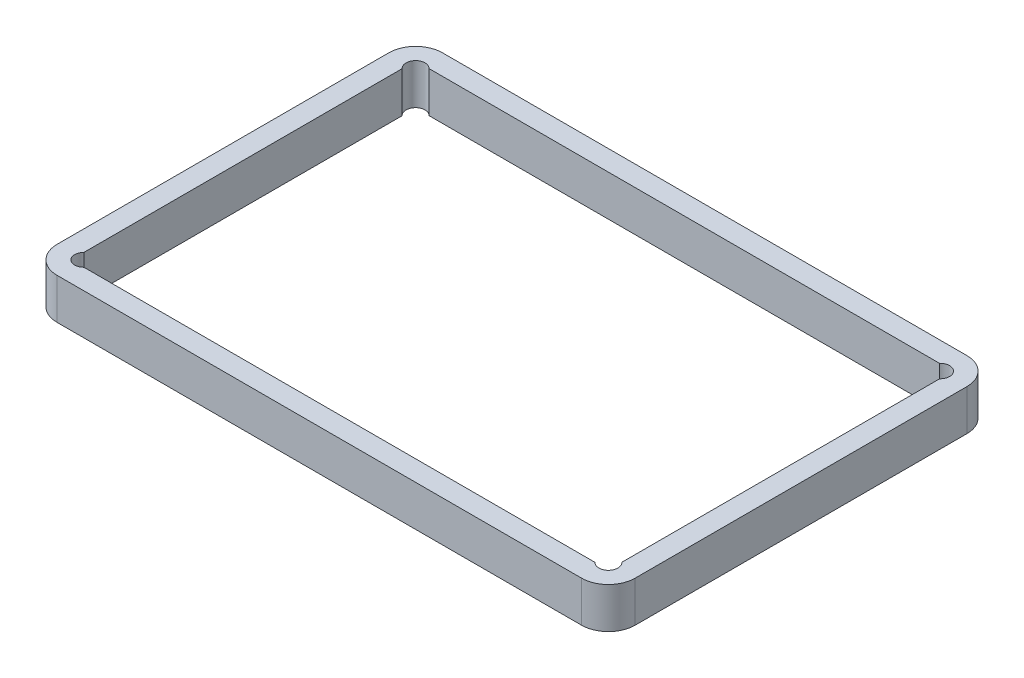
ISO-10303-21;
HEADER;
FILE_DESCRIPTION(('STEP AP214'),'2;1');
FILE_NAME('part.step','',(''),(''),'','','');
FILE_SCHEMA(('AUTOMOTIVE_DESIGN { 1 0 10303 214 1 1 1 1 }'));
ENDSEC;
DATA;
#1=APPLICATION_CONTEXT('core data for automotive mechanical design processes');
#2=APPLICATION_PROTOCOL_DEFINITION('international standard','automotive_design',2000,#1);
#3=PRODUCT_CONTEXT('',#1,'mechanical');
#4=PRODUCT('Part','Part','',(#3));
#5=PRODUCT_RELATED_PRODUCT_CATEGORY('part','',(#4));
#6=PRODUCT_DEFINITION_FORMATION('','',#4);
#7=PRODUCT_DEFINITION_CONTEXT('part definition',#1,'design');
#8=PRODUCT_DEFINITION('design','',#6,#7);
#9=PRODUCT_DEFINITION_SHAPE('','',#8);
#10=(LENGTH_UNIT() NAMED_UNIT(*) SI_UNIT(.MILLI.,.METRE.));
#11=(NAMED_UNIT(*) PLANE_ANGLE_UNIT() SI_UNIT($,.RADIAN.));
#12=(NAMED_UNIT(*) SI_UNIT($,.STERADIAN.) SOLID_ANGLE_UNIT());
#13=UNCERTAINTY_MEASURE_WITH_UNIT(LENGTH_MEASURE(1.E-05),#10,'distance_accuracy_value','');
#14=(GEOMETRIC_REPRESENTATION_CONTEXT(3) GLOBAL_UNCERTAINTY_ASSIGNED_CONTEXT((#13)) GLOBAL_UNIT_ASSIGNED_CONTEXT((#10,
#11,#12)) REPRESENTATION_CONTEXT('',''));
#15=CARTESIAN_POINT('',(0.,0.,0.));
#16=DIRECTION('',(0.,0.,1.));
#17=DIRECTION('',(1.,0.,0.));
#18=AXIS2_PLACEMENT_3D('',#15,#16,#17);
#19=CARTESIAN_POINT('',(-40.825,6.35,-25.825));
#20=DIRECTION('',(0.,1.,0.));
#21=DIRECTION('',(0.,0.,1.));
#22=AXIS2_PLACEMENT_3D('',#19,#20,#21);
#23=PLANE('',#22);
#24=CARTESIAN_POINT('',(-40.8250000000023,6.35,-25.8135633602445));
#25=DIRECTION('',(0.,-1.,0.));
#26=DIRECTION('',(0.,0.,-1.));
#27=AXIS2_PLACEMENT_3D('',#24,#25,#26);
#28=CIRCLE('',#27,1.47320000000609);
#29=CARTESIAN_POINT('',(-41.825,6.35,-24.7317508811047));
#30=VERTEX_POINT('',#29);
#31=CARTESIAN_POINT('',(-39.7538724801533,6.35,-26.825));
#32=VERTEX_POINT('',#31);
#33=EDGE_CURVE('E46',#30,#32,#28,.T.);
#34=ORIENTED_EDGE('',*,*,#33,.T.);
#35=DIRECTION('',(-1.,0.,0.));
#36=VECTOR('',#35,1.);
#37=CARTESIAN_POINT('',(-40.825,6.35,-26.825));
#38=LINE('',#37,#36);
#39=CARTESIAN_POINT('',(39.7431875208462,6.35,-26.825));
#40=VERTEX_POINT('',#39);
#41=EDGE_CURVE('E156',#40,#32,#38,.T.);
#42=ORIENTED_EDGE('',*,*,#41,.F.);
#43=CARTESIAN_POINT('',(40.8249999999977,6.35,-25.8250000000149));
#44=DIRECTION('',(0.,-1.,0.));
#45=DIRECTION('',(0.,0.,-1.));
#46=AXIS2_PLACEMENT_3D('',#43,#44,#45);
#47=CIRCLE('',#46,1.47320000000611);
#48=CARTESIAN_POINT('',(41.825,6.35,-24.7431875208794));
#49=VERTEX_POINT('',#48);
#50=EDGE_CURVE('E54',#40,#49,#47,.T.);
#51=ORIENTED_EDGE('',*,*,#50,.T.);
#52=DIRECTION('',(0.,0.,-1.));
#53=VECTOR('',#52,1.);
#54=CARTESIAN_POINT('',(41.825,6.35,-25.825));
#55=LINE('',#54,#53);
#56=CARTESIAN_POINT('',(41.825,6.35,24.7330671509533));
#57=VERTEX_POINT('',#56);
#58=EDGE_CURVE('E241',#57,#49,#55,.T.);
#59=ORIENTED_EDGE('',*,*,#58,.F.);
#60=CARTESIAN_POINT('',(40.8249999999984,6.35,25.8148796300894));
#61=DIRECTION('',(0.,-1.,0.));
#62=DIRECTION('',(0.,0.,-1.));
#63=AXIS2_PLACEMENT_3D('',#60,#61,#62);
#64=CIRCLE('',#63,1.47320000000605);
#65=CARTESIAN_POINT('',(39.7526310903831,6.35,26.825));
#66=VERTEX_POINT('',#65);
#67=EDGE_CURVE('E267',#57,#66,#64,.T.);
#68=ORIENTED_EDGE('',*,*,#67,.T.);
#69=DIRECTION('',(1.,0.,0.));
#70=VECTOR('',#69,1.);
#71=CARTESIAN_POINT('',(40.825,6.35,26.825));
#72=LINE('',#71,#70);
#73=CARTESIAN_POINT('',(-39.8134557548053,6.35,26.825));
#74=VERTEX_POINT('',#73);
#75=EDGE_CURVE('E165',#74,#66,#72,.T.);
#76=ORIENTED_EDGE('',*,*,#75,.F.);
#77=CARTESIAN_POINT('',(-40.8250000000016,6.35,25.8249999999863));
#78=DIRECTION('',(0.,-1.,0.));
#79=DIRECTION('',(0.,0.,-1.));
#80=AXIS2_PLACEMENT_3D('',#77,#78,#79);
#81=CIRCLE('',#80,1.42240000000603);
#82=CARTESIAN_POINT('',(-41.825,6.35,24.8134557547748));
#83=VERTEX_POINT('',#82);
#84=EDGE_CURVE('E251',#74,#83,#81,.T.);
#85=ORIENTED_EDGE('',*,*,#84,.T.);
#86=DIRECTION('',(0.,0.,1.));
#87=VECTOR('',#86,1.);
#88=CARTESIAN_POINT('',(-41.825,6.35,25.825));
#89=LINE('',#88,#87);
#90=EDGE_CURVE('E194',#30,#83,#89,.T.);
#91=ORIENTED_EDGE('',*,*,#90,.F.);
#92=EDGE_LOOP('',(#34,#42,#51,#59,#68,#76,#85,#91));
#93=FACE_BOUND('',#92,.T.);
#94=CARTESIAN_POINT('',(-40.825,6.35,-25.825));
#95=DIRECTION('',(0.,1.,0.));
#96=DIRECTION('',(0.,0.,1.));
#97=AXIS2_PLACEMENT_3D('',#94,#95,#96);
#98=CIRCLE('',#97,4.17499999999999);
#99=CARTESIAN_POINT('',(-40.825,6.35,-30.));
#100=VERTEX_POINT('',#99);
#101=CARTESIAN_POINT('',(-45.,6.35,-25.825));
#102=VERTEX_POINT('',#101);
#103=EDGE_CURVE('E171',#100,#102,#98,.T.);
#104=ORIENTED_EDGE('',*,*,#103,.T.);
#105=DIRECTION('',(0.,0.,1.));
#106=VECTOR('',#105,1.);
#107=CARTESIAN_POINT('',(-45.,6.35,-25.825));
#108=LINE('',#107,#106);
#109=CARTESIAN_POINT('',(-45.,6.35,25.825));
#110=VERTEX_POINT('',#109);
#111=EDGE_CURVE('E174',#102,#110,#108,.T.);
#112=ORIENTED_EDGE('',*,*,#111,.T.);
#113=CARTESIAN_POINT('',(-40.825,6.35,25.825));
#114=DIRECTION('',(0.,1.,0.));
#115=DIRECTION('',(0.,0.,1.));
#116=AXIS2_PLACEMENT_3D('',#113,#114,#115);
#117=CIRCLE('',#116,4.17500000000001);
#118=CARTESIAN_POINT('',(-40.825,6.35,30.));
#119=VERTEX_POINT('',#118);
#120=EDGE_CURVE('E177',#110,#119,#117,.T.);
#121=ORIENTED_EDGE('',*,*,#120,.T.);
#122=DIRECTION('',(1.,0.,0.));
#123=VECTOR('',#122,1.);
#124=CARTESIAN_POINT('',(-40.825,6.35,30.));
#125=LINE('',#124,#123);
#126=CARTESIAN_POINT('',(40.825,6.35,30.));
#127=VERTEX_POINT('',#126);
#128=EDGE_CURVE('E179',#119,#127,#125,.T.);
#129=ORIENTED_EDGE('',*,*,#128,.T.);
#130=CARTESIAN_POINT('',(40.825,6.35,25.825));
#131=DIRECTION('',(0.,1.,0.));
#132=DIRECTION('',(0.,0.,1.));
#133=AXIS2_PLACEMENT_3D('',#130,#131,#132);
#134=CIRCLE('',#133,4.17499999999999);
#135=CARTESIAN_POINT('',(45.,6.35,25.825));
#136=VERTEX_POINT('',#135);
#137=EDGE_CURVE('E181',#127,#136,#134,.T.);
#138=ORIENTED_EDGE('',*,*,#137,.T.);
#139=DIRECTION('',(0.,0.,-1.));
#140=VECTOR('',#139,1.);
#141=CARTESIAN_POINT('',(45.,6.35,-25.825));
#142=LINE('',#141,#140);
#143=CARTESIAN_POINT('',(45.,6.35,-25.825));
#144=VERTEX_POINT('',#143);
#145=EDGE_CURVE('E183',#136,#144,#142,.T.);
#146=ORIENTED_EDGE('',*,*,#145,.T.);
#147=CARTESIAN_POINT('',(40.825,6.35,-25.825));
#148=DIRECTION('',(0.,1.,0.));
#149=DIRECTION('',(0.,0.,1.));
#150=AXIS2_PLACEMENT_3D('',#147,#148,#149);
#151=CIRCLE('',#150,4.175);
#152=CARTESIAN_POINT('',(40.825,6.35,-30.));
#153=VERTEX_POINT('',#152);
#154=EDGE_CURVE('E185',#144,#153,#151,.T.);
#155=ORIENTED_EDGE('',*,*,#154,.T.);
#156=DIRECTION('',(-1.,0.,0.));
#157=VECTOR('',#156,1.);
#158=CARTESIAN_POINT('',(-40.825,6.35,-30.));
#159=LINE('',#158,#157);
#160=EDGE_CURVE('E187',#153,#100,#159,.T.);
#161=ORIENTED_EDGE('',*,*,#160,.T.);
#162=EDGE_LOOP('',(#104,#112,#121,#129,#138,#146,#155,#161));
#163=FACE_BOUND('',#162,.T.);
#164=ADVANCED_FACE('F32',(#93,#163),#23,.T.);
#165=CARTESIAN_POINT('',(-40.825,0.,-25.825));
#166=DIRECTION('',(0.,1.,0.));
#167=DIRECTION('',(0.,0.,1.));
#168=AXIS2_PLACEMENT_3D('',#165,#166,#167);
#169=PLANE('',#168);
#170=CARTESIAN_POINT('',(-40.825,0.,-25.825));
#171=DIRECTION('',(0.,1.,0.));
#172=DIRECTION('',(0.,0.,1.));
#173=AXIS2_PLACEMENT_3D('',#170,#171,#172);
#174=CIRCLE('',#173,4.17499999999999);
#175=CARTESIAN_POINT('',(-40.825,0.,-30.));
#176=VERTEX_POINT('',#175);
#177=CARTESIAN_POINT('',(-45.,0.,-25.825));
#178=VERTEX_POINT('',#177);
#179=EDGE_CURVE('E190',#176,#178,#174,.T.);
#180=ORIENTED_EDGE('',*,*,#179,.F.);
#181=DIRECTION('',(-1.,0.,0.));
#182=VECTOR('',#181,1.);
#183=CARTESIAN_POINT('',(-40.825,0.,-30.));
#184=LINE('',#183,#182);
#185=CARTESIAN_POINT('',(40.825,0.,-30.));
#186=VERTEX_POINT('',#185);
#187=EDGE_CURVE('E175',#186,#176,#184,.T.);
#188=ORIENTED_EDGE('',*,*,#187,.F.);
#189=CARTESIAN_POINT('',(40.825,0.,-25.825));
#190=DIRECTION('',(0.,1.,0.));
#191=DIRECTION('',(0.,0.,1.));
#192=AXIS2_PLACEMENT_3D('',#189,#190,#191);
#193=CIRCLE('',#192,4.175);
#194=CARTESIAN_POINT('',(45.,0.,-25.825));
#195=VERTEX_POINT('',#194);
#196=EDGE_CURVE('E204',#195,#186,#193,.T.);
#197=ORIENTED_EDGE('',*,*,#196,.F.);
#198=DIRECTION('',(0.,0.,-1.));
#199=VECTOR('',#198,1.);
#200=CARTESIAN_POINT('',(45.,0.,-25.825));
#201=LINE('',#200,#199);
#202=CARTESIAN_POINT('',(45.,0.,25.825));
#203=VERTEX_POINT('',#202);
#204=EDGE_CURVE('E202',#203,#195,#201,.T.);
#205=ORIENTED_EDGE('',*,*,#204,.F.);
#206=CARTESIAN_POINT('',(40.825,0.,25.825));
#207=DIRECTION('',(0.,1.,0.));
#208=DIRECTION('',(0.,0.,1.));
#209=AXIS2_PLACEMENT_3D('',#206,#207,#208);
#210=CIRCLE('',#209,4.17499999999999);
#211=CARTESIAN_POINT('',(40.825,0.,30.));
#212=VERTEX_POINT('',#211);
#213=EDGE_CURVE('E200',#212,#203,#210,.T.);
#214=ORIENTED_EDGE('',*,*,#213,.F.);
#215=DIRECTION('',(1.,0.,0.));
#216=VECTOR('',#215,1.);
#217=CARTESIAN_POINT('',(-40.825,0.,30.));
#218=LINE('',#217,#216);
#219=CARTESIAN_POINT('',(-40.825,0.,30.));
#220=VERTEX_POINT('',#219);
#221=EDGE_CURVE('E198',#220,#212,#218,.T.);
#222=ORIENTED_EDGE('',*,*,#221,.F.);
#223=CARTESIAN_POINT('',(-40.825,0.,25.825));
#224=DIRECTION('',(0.,1.,0.));
#225=DIRECTION('',(0.,0.,1.));
#226=AXIS2_PLACEMENT_3D('',#223,#224,#225);
#227=CIRCLE('',#226,4.17500000000001);
#228=CARTESIAN_POINT('',(-45.,0.,25.825));
#229=VERTEX_POINT('',#228);
#230=EDGE_CURVE('E196',#229,#220,#227,.T.);
#231=ORIENTED_EDGE('',*,*,#230,.F.);
#232=DIRECTION('',(0.,0.,1.));
#233=VECTOR('',#232,1.);
#234=CARTESIAN_POINT('',(-45.,0.,-25.825));
#235=LINE('',#234,#233);
#236=EDGE_CURVE('E193',#178,#229,#235,.T.);
#237=ORIENTED_EDGE('',*,*,#236,.F.);
#238=EDGE_LOOP('',(#180,#188,#197,#205,#214,#222,#231,#237));
#239=FACE_BOUND('',#238,.T.);
#240=DIRECTION('',(-1.,0.,0.));
#241=VECTOR('',#240,1.);
#242=CARTESIAN_POINT('',(-40.825,0.,-26.825));
#243=LINE('',#242,#241);
#244=CARTESIAN_POINT('',(39.7431875208462,0.,-26.825));
#245=VERTEX_POINT('',#244);
#246=CARTESIAN_POINT('',(-39.7538724801533,0.,-26.825));
#247=VERTEX_POINT('',#246);
#248=EDGE_CURVE('E154',#245,#247,#243,.T.);
#249=ORIENTED_EDGE('',*,*,#248,.T.);
#250=CARTESIAN_POINT('',(-40.8250000000023,0.,-25.8135633602445));
#251=DIRECTION('',(0.,-1.,0.));
#252=DIRECTION('',(0.,0.,-1.));
#253=AXIS2_PLACEMENT_3D('',#250,#251,#252);
#254=CIRCLE('',#253,1.47320000000609);
#255=CARTESIAN_POINT('',(-41.825,0.,-24.7317508811047));
#256=VERTEX_POINT('',#255);
#257=EDGE_CURVE('E142',#256,#247,#254,.T.);
#258=ORIENTED_EDGE('',*,*,#257,.F.);
#259=DIRECTION('',(0.,0.,1.));
#260=VECTOR('',#259,1.);
#261=CARTESIAN_POINT('',(-41.825,0.,25.825));
#262=LINE('',#261,#260);
#263=CARTESIAN_POINT('',(-41.825,0.,24.8134557547748));
#264=VERTEX_POINT('',#263);
#265=EDGE_CURVE('E162',#256,#264,#262,.T.);
#266=ORIENTED_EDGE('',*,*,#265,.T.);
#267=CARTESIAN_POINT('',(-40.8250000000016,0.,25.8249999999863));
#268=DIRECTION('',(0.,-1.,0.));
#269=DIRECTION('',(0.,0.,-1.));
#270=AXIS2_PLACEMENT_3D('',#267,#268,#269);
#271=CIRCLE('',#270,1.42240000000603);
#272=CARTESIAN_POINT('',(-39.8134557548053,0.,26.825));
#273=VERTEX_POINT('',#272);
#274=EDGE_CURVE('E257',#273,#264,#271,.T.);
#275=ORIENTED_EDGE('',*,*,#274,.F.);
#276=DIRECTION('',(1.,0.,0.));
#277=VECTOR('',#276,1.);
#278=CARTESIAN_POINT('',(40.825,0.,26.825));
#279=LINE('',#278,#277);
#280=CARTESIAN_POINT('',(39.7526310903831,0.,26.825));
#281=VERTEX_POINT('',#280);
#282=EDGE_CURVE('E167',#273,#281,#279,.T.);
#283=ORIENTED_EDGE('',*,*,#282,.T.);
#284=CARTESIAN_POINT('',(40.8249999999984,0.,25.8148796300894));
#285=DIRECTION('',(0.,-1.,0.));
#286=DIRECTION('',(0.,0.,-1.));
#287=AXIS2_PLACEMENT_3D('',#284,#285,#286);
#288=CIRCLE('',#287,1.47320000000605);
#289=CARTESIAN_POINT('',(41.825,0.,24.7330671509533));
#290=VERTEX_POINT('',#289);
#291=EDGE_CURVE('E270',#290,#281,#288,.T.);
#292=ORIENTED_EDGE('',*,*,#291,.F.);
#293=DIRECTION('',(0.,0.,-1.));
#294=VECTOR('',#293,1.);
#295=CARTESIAN_POINT('',(41.825,0.,-25.825));
#296=LINE('',#295,#294);
#297=CARTESIAN_POINT('',(41.825,0.,-24.7431875208794));
#298=VERTEX_POINT('',#297);
#299=EDGE_CURVE('E163',#290,#298,#296,.T.);
#300=ORIENTED_EDGE('',*,*,#299,.T.);
#301=CARTESIAN_POINT('',(40.8249999999977,0.,-25.8250000000149));
#302=DIRECTION('',(0.,-1.,0.));
#303=DIRECTION('',(0.,0.,-1.));
#304=AXIS2_PLACEMENT_3D('',#301,#302,#303);
#305=CIRCLE('',#304,1.47320000000611);
#306=EDGE_CURVE('E157',#245,#298,#305,.T.);
#307=ORIENTED_EDGE('',*,*,#306,.F.);
#308=EDGE_LOOP('',(#249,#258,#266,#275,#283,#292,#300,#307));
#309=FACE_BOUND('',#308,.T.);
#310=ADVANCED_FACE('F160',(#239,#309),#169,.F.);
#311=CARTESIAN_POINT('',(-40.825,6.35,-25.825));
#312=DIRECTION('',(0.,-1.,0.));
#313=DIRECTION('',(0.,0.,-1.));
#314=AXIS2_PLACEMENT_3D('',#311,#312,#313);
#315=CYLINDRICAL_SURFACE('',#314,4.17499999999999);
#316=ORIENTED_EDGE('',*,*,#179,.T.);
#317=DIRECTION('',(0.,-1.,0.));
#318=VECTOR('',#317,1.);
#319=CARTESIAN_POINT('',(-45.,6.35,-25.825));
#320=LINE('',#319,#318);
#321=EDGE_CURVE('E227',#102,#178,#320,.T.);
#322=ORIENTED_EDGE('',*,*,#321,.F.);
#323=ORIENTED_EDGE('',*,*,#103,.F.);
#324=DIRECTION('',(0.,-1.,0.));
#325=VECTOR('',#324,1.);
#326=CARTESIAN_POINT('',(-40.825,6.35,-30.));
#327=LINE('',#326,#325);
#328=EDGE_CURVE('E189',#100,#176,#327,.T.);
#329=ORIENTED_EDGE('',*,*,#328,.T.);
#330=EDGE_LOOP('',(#316,#322,#323,#329));
#331=FACE_BOUND('',#330,.T.);
#332=ADVANCED_FACE('F34',(#331),#315,.T.);
#333=CARTESIAN_POINT('',(-45.,6.35,-25.825));
#334=DIRECTION('',(1.,0.,0.));
#335=DIRECTION('',(0.,0.,-1.));
#336=AXIS2_PLACEMENT_3D('',#333,#334,#335);
#337=PLANE('',#336);
#338=ORIENTED_EDGE('',*,*,#236,.T.);
#339=DIRECTION('',(0.,-1.,0.));
#340=VECTOR('',#339,1.);
#341=CARTESIAN_POINT('',(-45.,6.35,25.825));
#342=LINE('',#341,#340);
#343=EDGE_CURVE('E224',#110,#229,#342,.T.);
#344=ORIENTED_EDGE('',*,*,#343,.F.);
#345=ORIENTED_EDGE('',*,*,#111,.F.);
#346=ORIENTED_EDGE('',*,*,#321,.T.);
#347=EDGE_LOOP('',(#338,#344,#345,#346));
#348=FACE_BOUND('',#347,.T.);
#349=ADVANCED_FACE('F325',(#348),#337,.F.);
#350=CARTESIAN_POINT('',(-40.825,6.35,25.825));
#351=DIRECTION('',(0.,-1.,0.));
#352=DIRECTION('',(0.,0.,-1.));
#353=AXIS2_PLACEMENT_3D('',#350,#351,#352);
#354=CYLINDRICAL_SURFACE('',#353,4.17500000000001);
#355=ORIENTED_EDGE('',*,*,#230,.T.);
#356=DIRECTION('',(0.,-1.,0.));
#357=VECTOR('',#356,1.);
#358=CARTESIAN_POINT('',(-40.825,6.35,30.));
#359=LINE('',#358,#357);
#360=EDGE_CURVE('E221',#119,#220,#359,.T.);
#361=ORIENTED_EDGE('',*,*,#360,.F.);
#362=ORIENTED_EDGE('',*,*,#120,.F.);
#363=ORIENTED_EDGE('',*,*,#343,.T.);
#364=EDGE_LOOP('',(#355,#361,#362,#363));
#365=FACE_BOUND('',#364,.T.);
#366=ADVANCED_FACE('F322',(#365),#354,.T.);
#367=CARTESIAN_POINT('',(-40.825,6.35,30.));
#368=DIRECTION('',(0.,0.,-1.));
#369=DIRECTION('',(-1.,0.,0.));
#370=AXIS2_PLACEMENT_3D('',#367,#368,#369);
#371=PLANE('',#370);
#372=ORIENTED_EDGE('',*,*,#221,.T.);
#373=DIRECTION('',(0.,-1.,0.));
#374=VECTOR('',#373,1.);
#375=CARTESIAN_POINT('',(40.825,6.35,30.));
#376=LINE('',#375,#374);
#377=EDGE_CURVE('E218',#127,#212,#376,.T.);
#378=ORIENTED_EDGE('',*,*,#377,.F.);
#379=ORIENTED_EDGE('',*,*,#128,.F.);
#380=ORIENTED_EDGE('',*,*,#360,.T.);
#381=EDGE_LOOP('',(#372,#378,#379,#380));
#382=FACE_BOUND('',#381,.T.);
#383=ADVANCED_FACE('F318',(#382),#371,.F.);
#384=CARTESIAN_POINT('',(40.825,6.35,25.825));
#385=DIRECTION('',(0.,-1.,0.));
#386=DIRECTION('',(0.,0.,-1.));
#387=AXIS2_PLACEMENT_3D('',#384,#385,#386);
#388=CYLINDRICAL_SURFACE('',#387,4.17499999999999);
#389=ORIENTED_EDGE('',*,*,#213,.T.);
#390=DIRECTION('',(0.,-1.,0.));
#391=VECTOR('',#390,1.);
#392=CARTESIAN_POINT('',(45.,6.35,25.825));
#393=LINE('',#392,#391);
#394=EDGE_CURVE('E215',#136,#203,#393,.T.);
#395=ORIENTED_EDGE('',*,*,#394,.F.);
#396=ORIENTED_EDGE('',*,*,#137,.F.);
#397=ORIENTED_EDGE('',*,*,#377,.T.);
#398=EDGE_LOOP('',(#389,#395,#396,#397));
#399=FACE_BOUND('',#398,.T.);
#400=ADVANCED_FACE('F314',(#399),#388,.T.);
#401=CARTESIAN_POINT('',(45.,6.35,-25.825));
#402=DIRECTION('',(-1.,0.,0.));
#403=DIRECTION('',(0.,0.,1.));
#404=AXIS2_PLACEMENT_3D('',#401,#402,#403);
#405=PLANE('',#404);
#406=ORIENTED_EDGE('',*,*,#204,.T.);
#407=DIRECTION('',(0.,-1.,0.));
#408=VECTOR('',#407,1.);
#409=CARTESIAN_POINT('',(45.,6.35,-25.825));
#410=LINE('',#409,#408);
#411=EDGE_CURVE('E212',#144,#195,#410,.T.);
#412=ORIENTED_EDGE('',*,*,#411,.F.);
#413=ORIENTED_EDGE('',*,*,#145,.F.);
#414=ORIENTED_EDGE('',*,*,#394,.T.);
#415=EDGE_LOOP('',(#406,#412,#413,#414));
#416=FACE_BOUND('',#415,.T.);
#417=ADVANCED_FACE('F310',(#416),#405,.F.);
#418=CARTESIAN_POINT('',(40.825,6.35,-25.825));
#419=DIRECTION('',(0.,-1.,0.));
#420=DIRECTION('',(0.,0.,-1.));
#421=AXIS2_PLACEMENT_3D('',#418,#419,#420);
#422=CYLINDRICAL_SURFACE('',#421,4.175);
#423=ORIENTED_EDGE('',*,*,#196,.T.);
#424=DIRECTION('',(0.,-1.,0.));
#425=VECTOR('',#424,1.);
#426=CARTESIAN_POINT('',(40.825,6.35,-30.));
#427=LINE('',#426,#425);
#428=EDGE_CURVE('E209',#153,#186,#427,.T.);
#429=ORIENTED_EDGE('',*,*,#428,.F.);
#430=ORIENTED_EDGE('',*,*,#154,.F.);
#431=ORIENTED_EDGE('',*,*,#411,.T.);
#432=EDGE_LOOP('',(#423,#429,#430,#431));
#433=FACE_BOUND('',#432,.T.);
#434=ADVANCED_FACE('F306',(#433),#422,.T.);
#435=CARTESIAN_POINT('',(-40.825,6.35,-30.));
#436=DIRECTION('',(0.,0.,1.));
#437=DIRECTION('',(1.,0.,0.));
#438=AXIS2_PLACEMENT_3D('',#435,#436,#437);
#439=PLANE('',#438);
#440=ORIENTED_EDGE('',*,*,#187,.T.);
#441=ORIENTED_EDGE('',*,*,#328,.F.);
#442=ORIENTED_EDGE('',*,*,#160,.F.);
#443=ORIENTED_EDGE('',*,*,#428,.T.);
#444=EDGE_LOOP('',(#440,#441,#442,#443));
#445=FACE_BOUND('',#444,.T.);
#446=ADVANCED_FACE('F303',(#445),#439,.F.);
#447=CARTESIAN_POINT('',(40.825,6.35,26.825));
#448=DIRECTION('',(0.,0.,-1.));
#449=DIRECTION('',(-1.,0.,0.));
#450=AXIS2_PLACEMENT_3D('',#447,#448,#449);
#451=PLANE('',#450);
#452=DIRECTION('',(0.,-1.,0.));
#453=VECTOR('',#452,1.);
#454=CARTESIAN_POINT('',(39.7526310903831,6.35,26.825));
#455=LINE('',#454,#453);
#456=EDGE_CURVE('E265',#281,#66,#455,.F.);
#457=ORIENTED_EDGE('',*,*,#456,.F.);
#458=ORIENTED_EDGE('',*,*,#282,.F.);
#459=DIRECTION('',(0.,-1.,0.));
#460=VECTOR('',#459,1.);
#461=CARTESIAN_POINT('',(-39.8134557548053,6.35,26.825));
#462=LINE('',#461,#460);
#463=EDGE_CURVE('E247',#74,#273,#462,.T.);
#464=ORIENTED_EDGE('',*,*,#463,.F.);
#465=ORIENTED_EDGE('',*,*,#75,.T.);
#466=EDGE_LOOP('',(#457,#458,#464,#465));
#467=FACE_BOUND('',#466,.T.);
#468=ADVANCED_FACE('F264',(#467),#451,.T.);
#469=CARTESIAN_POINT('',(41.825,6.35,-25.825));
#470=DIRECTION('',(-1.,0.,0.));
#471=DIRECTION('',(0.,0.,1.));
#472=AXIS2_PLACEMENT_3D('',#469,#470,#471);
#473=PLANE('',#472);
#474=DIRECTION('',(0.,-1.,0.));
#475=VECTOR('',#474,1.);
#476=CARTESIAN_POINT('',(41.825,6.35,-24.7431875208794));
#477=LINE('',#476,#475);
#478=EDGE_CURVE('E273',#298,#49,#477,.F.);
#479=ORIENTED_EDGE('',*,*,#478,.F.);
#480=ORIENTED_EDGE('',*,*,#299,.F.);
#481=DIRECTION('',(0.,-1.,0.));
#482=VECTOR('',#481,1.);
#483=CARTESIAN_POINT('',(41.825,6.35,24.7330671509533));
#484=LINE('',#483,#482);
#485=EDGE_CURVE('E233',#57,#290,#484,.T.);
#486=ORIENTED_EDGE('',*,*,#485,.F.);
#487=ORIENTED_EDGE('',*,*,#58,.T.);
#488=EDGE_LOOP('',(#479,#480,#486,#487));
#489=FACE_BOUND('',#488,.T.);
#490=ADVANCED_FACE('F281',(#489),#473,.T.);
#491=CARTESIAN_POINT('',(-40.825,6.35,-26.825));
#492=DIRECTION('',(0.,0.,1.));
#493=DIRECTION('',(1.,0.,0.));
#494=AXIS2_PLACEMENT_3D('',#491,#492,#493);
#495=PLANE('',#494);
#496=DIRECTION('',(0.,-1.,0.));
#497=VECTOR('',#496,1.);
#498=CARTESIAN_POINT('',(-39.7538724801533,6.35,-26.825));
#499=LINE('',#498,#497);
#500=EDGE_CURVE('E145',#247,#32,#499,.F.);
#501=ORIENTED_EDGE('',*,*,#500,.F.);
#502=ORIENTED_EDGE('',*,*,#248,.F.);
#503=DIRECTION('',(0.,-1.,0.));
#504=VECTOR('',#503,1.);
#505=CARTESIAN_POINT('',(39.7431875208462,6.35,-26.825));
#506=LINE('',#505,#504);
#507=EDGE_CURVE('E40',#40,#245,#506,.T.);
#508=ORIENTED_EDGE('',*,*,#507,.F.);
#509=ORIENTED_EDGE('',*,*,#41,.T.);
#510=EDGE_LOOP('',(#501,#502,#508,#509));
#511=FACE_BOUND('',#510,.T.);
#512=ADVANCED_FACE('F153',(#511),#495,.T.);
#513=CARTESIAN_POINT('',(-41.825,6.35,25.825));
#514=DIRECTION('',(1.,0.,0.));
#515=DIRECTION('',(0.,0.,-1.));
#516=AXIS2_PLACEMENT_3D('',#513,#514,#515);
#517=PLANE('',#516);
#518=DIRECTION('',(0.,-1.,0.));
#519=VECTOR('',#518,1.);
#520=CARTESIAN_POINT('',(-41.825,6.35,-24.7317508811047));
#521=LINE('',#520,#519);
#522=EDGE_CURVE('E11',#30,#256,#521,.T.);
#523=ORIENTED_EDGE('',*,*,#522,.F.);
#524=ORIENTED_EDGE('',*,*,#90,.T.);
#525=DIRECTION('',(0.,-1.,0.));
#526=VECTOR('',#525,1.);
#527=CARTESIAN_POINT('',(-41.825,6.35,24.8134557547748));
#528=LINE('',#527,#526);
#529=EDGE_CURVE('E230',#264,#83,#528,.F.);
#530=ORIENTED_EDGE('',*,*,#529,.F.);
#531=ORIENTED_EDGE('',*,*,#265,.F.);
#532=EDGE_LOOP('',(#523,#524,#530,#531));
#533=FACE_BOUND('',#532,.T.);
#534=ADVANCED_FACE('F291',(#533),#517,.T.);
#535=CARTESIAN_POINT('',(-40.8250000000016,6.35,25.8249999999863));
#536=DIRECTION('',(0.,-1.,0.));
#537=DIRECTION('',(0.,0.,-1.));
#538=AXIS2_PLACEMENT_3D('',#535,#536,#537);
#539=CYLINDRICAL_SURFACE('',#538,1.42240000000603);
#540=ORIENTED_EDGE('',*,*,#463,.T.);
#541=ORIENTED_EDGE('',*,*,#274,.T.);
#542=ORIENTED_EDGE('',*,*,#529,.T.);
#543=ORIENTED_EDGE('',*,*,#84,.F.);
#544=EDGE_LOOP('',(#540,#541,#542,#543));
#545=FACE_BOUND('',#544,.T.);
#546=ADVANCED_FACE('F284',(#545),#539,.F.);
#547=CARTESIAN_POINT('',(40.8249999999984,6.35,25.8148796300894));
#548=DIRECTION('',(0.,-1.,0.));
#549=DIRECTION('',(0.,0.,-1.));
#550=AXIS2_PLACEMENT_3D('',#547,#548,#549);
#551=CYLINDRICAL_SURFACE('',#550,1.47320000000605);
#552=ORIENTED_EDGE('',*,*,#456,.T.);
#553=ORIENTED_EDGE('',*,*,#67,.F.);
#554=ORIENTED_EDGE('',*,*,#485,.T.);
#555=ORIENTED_EDGE('',*,*,#291,.T.);
#556=EDGE_LOOP('',(#552,#553,#554,#555));
#557=FACE_BOUND('',#556,.T.);
#558=ADVANCED_FACE('F282',(#557),#551,.F.);
#559=CARTESIAN_POINT('',(40.8249999999977,6.35,-25.8250000000149));
#560=DIRECTION('',(0.,-1.,0.));
#561=DIRECTION('',(0.,0.,-1.));
#562=AXIS2_PLACEMENT_3D('',#559,#560,#561);
#563=CYLINDRICAL_SURFACE('',#562,1.47320000000611);
#564=ORIENTED_EDGE('',*,*,#478,.T.);
#565=ORIENTED_EDGE('',*,*,#50,.F.);
#566=ORIENTED_EDGE('',*,*,#507,.T.);
#567=ORIENTED_EDGE('',*,*,#306,.T.);
#568=EDGE_LOOP('',(#564,#565,#566,#567));
#569=FACE_BOUND('',#568,.T.);
#570=ADVANCED_FACE('F234',(#569),#563,.F.);
#571=CARTESIAN_POINT('',(-40.8250000000023,6.35,-25.8135633602445));
#572=DIRECTION('',(0.,-1.,0.));
#573=DIRECTION('',(0.,0.,-1.));
#574=AXIS2_PLACEMENT_3D('',#571,#572,#573);
#575=CYLINDRICAL_SURFACE('',#574,1.47320000000609);
#576=ORIENTED_EDGE('',*,*,#500,.T.);
#577=ORIENTED_EDGE('',*,*,#33,.F.);
#578=ORIENTED_EDGE('',*,*,#522,.T.);
#579=ORIENTED_EDGE('',*,*,#257,.T.);
#580=EDGE_LOOP('',(#576,#577,#578,#579));
#581=FACE_BOUND('',#580,.T.);
#582=ADVANCED_FACE('F144',(#581),#575,.F.);
#583=CLOSED_SHELL('',(#164,#310,#332,#349,#366,#383,#400,#417,#434,#446,#468,#490,#512,#534,
#546,#558,#570,#582));
#584=MANIFOLD_SOLID_BREP('B2',#583);
#585=ADVANCED_BREP_SHAPE_REPRESENTATION('',(#18,#584),#14);
#586=SHAPE_DEFINITION_REPRESENTATION(#9,#585);
ENDSEC;
END-ISO-10303-21;
